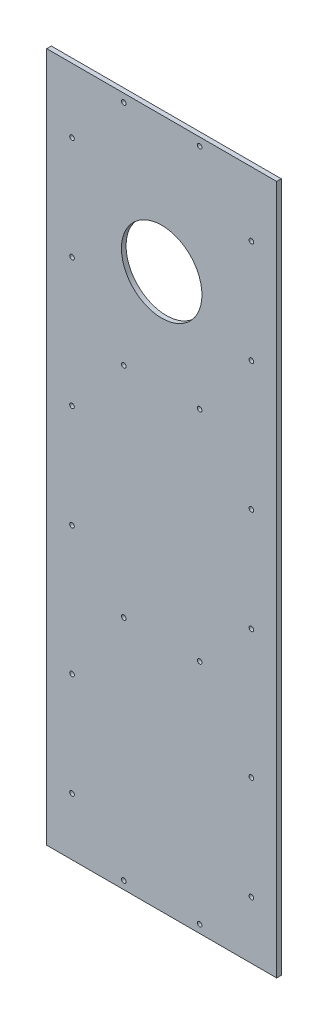
ISO-10303-21;
HEADER;
FILE_DESCRIPTION(('STEP AP214'),'2;1');
FILE_NAME('part.step','',(''),(''),'','','');
FILE_SCHEMA(('AUTOMOTIVE_DESIGN { 1 0 10303 214 1 1 1 1 }'));
ENDSEC;
DATA;
#1=APPLICATION_CONTEXT('core data for automotive mechanical design processes');
#2=APPLICATION_PROTOCOL_DEFINITION('international standard','automotive_design',2000,#1);
#3=PRODUCT_CONTEXT('',#1,'mechanical');
#4=PRODUCT('Part','Part','',(#3));
#5=PRODUCT_RELATED_PRODUCT_CATEGORY('part','',(#4));
#6=PRODUCT_DEFINITION_FORMATION('','',#4);
#7=PRODUCT_DEFINITION_CONTEXT('part definition',#1,'design');
#8=PRODUCT_DEFINITION('design','',#6,#7);
#9=PRODUCT_DEFINITION_SHAPE('','',#8);
#10=(LENGTH_UNIT() NAMED_UNIT(*) SI_UNIT(.MILLI.,.METRE.));
#11=(NAMED_UNIT(*) PLANE_ANGLE_UNIT() SI_UNIT($,.RADIAN.));
#12=(NAMED_UNIT(*) SI_UNIT($,.STERADIAN.) SOLID_ANGLE_UNIT());
#13=UNCERTAINTY_MEASURE_WITH_UNIT(LENGTH_MEASURE(1.E-05),#10,'distance_accuracy_value','');
#14=(GEOMETRIC_REPRESENTATION_CONTEXT(3) GLOBAL_UNCERTAINTY_ASSIGNED_CONTEXT((#13)) GLOBAL_UNIT_ASSIGNED_CONTEXT((#10,
#11,#12)) REPRESENTATION_CONTEXT('',''));
#15=CARTESIAN_POINT('',(0.,0.,0.));
#16=DIRECTION('',(0.,0.,1.));
#17=DIRECTION('',(1.,0.,0.));
#18=AXIS2_PLACEMENT_3D('',#15,#16,#17);
#19=CARTESIAN_POINT('',(-50.,-150.,2.));
#20=DIRECTION('',(1.,0.,0.));
#21=DIRECTION('',(0.,0.,-1.));
#22=AXIS2_PLACEMENT_3D('',#19,#20,#21);
#23=PLANE('',#22);
#24=DIRECTION('',(0.,-1.,0.));
#25=VECTOR('',#24,1.);
#26=CARTESIAN_POINT('',(-50.,-150.,0.));
#27=LINE('',#26,#25);
#28=CARTESIAN_POINT('',(-50.,150.,0.));
#29=VERTEX_POINT('',#28);
#30=CARTESIAN_POINT('',(-50.,-150.,0.));
#31=VERTEX_POINT('',#30);
#32=EDGE_CURVE('E104',#29,#31,#27,.T.);
#33=ORIENTED_EDGE('',*,*,#32,.T.);
#34=DIRECTION('',(0.,0.,-1.));
#35=VECTOR('',#34,1.);
#36=CARTESIAN_POINT('',(-50.,-150.,2.));
#37=LINE('',#36,#35);
#38=CARTESIAN_POINT('',(-50.,-150.,2.));
#39=VERTEX_POINT('',#38);
#40=EDGE_CURVE('E11',#39,#31,#37,.T.);
#41=ORIENTED_EDGE('',*,*,#40,.F.);
#42=DIRECTION('',(0.,-1.,0.));
#43=VECTOR('',#42,1.);
#44=CARTESIAN_POINT('',(-50.,-150.,2.));
#45=LINE('',#44,#43);
#46=CARTESIAN_POINT('',(-50.,150.,2.));
#47=VERTEX_POINT('',#46);
#48=EDGE_CURVE('E91',#47,#39,#45,.T.);
#49=ORIENTED_EDGE('',*,*,#48,.F.);
#50=DIRECTION('',(0.,0.,-1.));
#51=VECTOR('',#50,1.);
#52=CARTESIAN_POINT('',(-50.,150.,2.));
#53=LINE('',#52,#51);
#54=EDGE_CURVE('E100',#47,#29,#53,.T.);
#55=ORIENTED_EDGE('',*,*,#54,.T.);
#56=EDGE_LOOP('',(#33,#41,#49,#55));
#57=FACE_BOUND('',#56,.T.);
#58=ADVANCED_FACE('F38',(#57),#23,.F.);
#59=CARTESIAN_POINT('',(50.,-150.,2.));
#60=DIRECTION('',(0.,1.,0.));
#61=DIRECTION('',(0.,0.,1.));
#62=AXIS2_PLACEMENT_3D('',#59,#60,#61);
#63=PLANE('',#62);
#64=DIRECTION('',(1.,0.,0.));
#65=VECTOR('',#64,1.);
#66=CARTESIAN_POINT('',(50.,-150.,0.));
#67=LINE('',#66,#65);
#68=CARTESIAN_POINT('',(50.,-150.,0.));
#69=VERTEX_POINT('',#68);
#70=EDGE_CURVE('E95',#31,#69,#67,.T.);
#71=ORIENTED_EDGE('',*,*,#70,.T.);
#72=DIRECTION('',(0.,0.,-1.));
#73=VECTOR('',#72,1.);
#74=CARTESIAN_POINT('',(50.,-150.,2.));
#75=LINE('',#74,#73);
#76=CARTESIAN_POINT('',(50.,-150.,2.));
#77=VERTEX_POINT('',#76);
#78=EDGE_CURVE('E47',#77,#69,#75,.T.);
#79=ORIENTED_EDGE('',*,*,#78,.F.);
#80=DIRECTION('',(1.,0.,0.));
#81=VECTOR('',#80,1.);
#82=CARTESIAN_POINT('',(50.,-150.,2.));
#83=LINE('',#82,#81);
#84=EDGE_CURVE('E86',#39,#77,#83,.T.);
#85=ORIENTED_EDGE('',*,*,#84,.F.);
#86=ORIENTED_EDGE('',*,*,#40,.T.);
#87=EDGE_LOOP('',(#71,#79,#85,#86));
#88=FACE_BOUND('',#87,.T.);
#89=ADVANCED_FACE('F94',(#88),#63,.F.);
#90=CARTESIAN_POINT('',(50.,-150.,2.));
#91=DIRECTION('',(-1.,0.,0.));
#92=DIRECTION('',(0.,0.,1.));
#93=AXIS2_PLACEMENT_3D('',#90,#91,#92);
#94=PLANE('',#93);
#95=DIRECTION('',(0.,1.,0.));
#96=VECTOR('',#95,1.);
#97=CARTESIAN_POINT('',(50.,-150.,0.));
#98=LINE('',#97,#96);
#99=CARTESIAN_POINT('',(50.,150.,0.));
#100=VERTEX_POINT('',#99);
#101=EDGE_CURVE('E73',#69,#100,#98,.T.);
#102=ORIENTED_EDGE('',*,*,#101,.T.);
#103=DIRECTION('',(0.,0.,-1.));
#104=VECTOR('',#103,1.);
#105=CARTESIAN_POINT('',(50.,150.,2.));
#106=LINE('',#105,#104);
#107=CARTESIAN_POINT('',(50.,150.,2.));
#108=VERTEX_POINT('',#107);
#109=EDGE_CURVE('E96',#108,#100,#106,.T.);
#110=ORIENTED_EDGE('',*,*,#109,.F.);
#111=DIRECTION('',(0.,1.,0.));
#112=VECTOR('',#111,1.);
#113=CARTESIAN_POINT('',(50.,-150.,2.));
#114=LINE('',#113,#112);
#115=EDGE_CURVE('E89',#77,#108,#114,.T.);
#116=ORIENTED_EDGE('',*,*,#115,.F.);
#117=ORIENTED_EDGE('',*,*,#78,.T.);
#118=EDGE_LOOP('',(#102,#110,#116,#117));
#119=FACE_BOUND('',#118,.T.);
#120=ADVANCED_FACE('F98',(#119),#94,.F.);
#121=CARTESIAN_POINT('',(50.,150.,2.));
#122=DIRECTION('',(0.,-1.,0.));
#123=DIRECTION('',(1.,0.,0.));
#124=AXIS2_PLACEMENT_3D('',#121,#122,#123);
#125=PLANE('',#124);
#126=DIRECTION('',(-1.,0.,0.));
#127=VECTOR('',#126,1.);
#128=CARTESIAN_POINT('',(50.,150.,0.));
#129=LINE('',#128,#127);
#130=EDGE_CURVE('E79',#100,#29,#129,.T.);
#131=ORIENTED_EDGE('',*,*,#130,.T.);
#132=ORIENTED_EDGE('',*,*,#54,.F.);
#133=DIRECTION('',(-1.,0.,0.));
#134=VECTOR('',#133,1.);
#135=CARTESIAN_POINT('',(50.,150.,2.));
#136=LINE('',#135,#134);
#137=EDGE_CURVE('E56',#108,#47,#136,.T.);
#138=ORIENTED_EDGE('',*,*,#137,.F.);
#139=ORIENTED_EDGE('',*,*,#109,.T.);
#140=EDGE_LOOP('',(#131,#132,#138,#139));
#141=FACE_BOUND('',#140,.T.);
#142=ADVANCED_FACE('F238',(#141),#125,.F.);
#143=CARTESIAN_POINT('',(0.,0.,2.));
#144=DIRECTION('',(0.,0.,1.));
#145=DIRECTION('',(1.,0.,0.));
#146=AXIS2_PLACEMENT_3D('',#143,#144,#145);
#147=PLANE('',#146);
#148=CARTESIAN_POINT('',(16.4999999999995,47.5,2.));
#149=DIRECTION('',(0.,0.,1.));
#150=DIRECTION('',(1.,0.,0.));
#151=AXIS2_PLACEMENT_3D('',#148,#149,#150);
#152=CIRCLE('',#151,0.99999999999999);
#153=CARTESIAN_POINT('',(17.4999999999995,47.5,2.));
#154=VERTEX_POINT('',#153);
#155=EDGE_CURVE('E490',#154,#154,#152,.T.);
#156=ORIENTED_EDGE('',*,*,#155,.F.);
#157=EDGE_LOOP('',(#156));
#158=FACE_BOUND('',#157,.T.);
#159=CARTESIAN_POINT('',(-16.5000000000005,-47.5,2.));
#160=DIRECTION('',(0.,0.,1.));
#161=DIRECTION('',(1.,0.,0.));
#162=AXIS2_PLACEMENT_3D('',#159,#160,#161);
#163=CIRCLE('',#162,1.);
#164=CARTESIAN_POINT('',(-15.5000000000005,-47.5,2.));
#165=VERTEX_POINT('',#164);
#166=EDGE_CURVE('E491',#165,#165,#163,.T.);
#167=ORIENTED_EDGE('',*,*,#166,.F.);
#168=EDGE_LOOP('',(#167));
#169=FACE_BOUND('',#168,.T.);
#170=CARTESIAN_POINT('',(16.4999999999995,-47.5,2.));
#171=DIRECTION('',(0.,0.,1.));
#172=DIRECTION('',(1.,0.,0.));
#173=AXIS2_PLACEMENT_3D('',#170,#171,#172);
#174=CIRCLE('',#173,0.99999999999999);
#175=CARTESIAN_POINT('',(17.4999999999995,-47.5,2.));
#176=VERTEX_POINT('',#175);
#177=EDGE_CURVE('E495',#176,#176,#174,.T.);
#178=ORIENTED_EDGE('',*,*,#177,.F.);
#179=EDGE_LOOP('',(#178));
#180=FACE_BOUND('',#179,.T.);
#181=CARTESIAN_POINT('',(-16.5000000000005,47.5,2.));
#182=DIRECTION('',(0.,0.,1.));
#183=DIRECTION('',(1.,0.,0.));
#184=AXIS2_PLACEMENT_3D('',#181,#182,#183);
#185=CIRCLE('',#184,1.);
#186=CARTESIAN_POINT('',(-15.5000000000005,47.5,2.));
#187=VERTEX_POINT('',#186);
#188=EDGE_CURVE('E165',#187,#187,#185,.T.);
#189=ORIENTED_EDGE('',*,*,#188,.F.);
#190=EDGE_LOOP('',(#189));
#191=FACE_BOUND('',#190,.T.);
#192=CARTESIAN_POINT('',(0.,91.,2.));
#193=DIRECTION('',(0.,0.,1.));
#194=DIRECTION('',(1.,0.,0.));
#195=AXIS2_PLACEMENT_3D('',#192,#193,#194);
#196=CIRCLE('',#195,17.5);
#197=CARTESIAN_POINT('',(17.5,91.,2.));
#198=VERTEX_POINT('',#197);
#199=EDGE_CURVE('E176',#198,#198,#196,.T.);
#200=ORIENTED_EDGE('',*,*,#199,.F.);
#201=EDGE_LOOP('',(#200));
#202=FACE_BOUND('',#201,.T.);
#203=CARTESIAN_POINT('',(-39.,-23.9999999999995,2.));
#204=DIRECTION('',(0.,0.,1.));
#205=DIRECTION('',(1.,0.,0.));
#206=AXIS2_PLACEMENT_3D('',#203,#204,#205);
#207=CIRCLE('',#206,0.999999999999998);
#208=CARTESIAN_POINT('',(-38.,-23.9999999999995,2.));
#209=VERTEX_POINT('',#208);
#210=EDGE_CURVE('E213',#209,#209,#207,.T.);
#211=ORIENTED_EDGE('',*,*,#210,.F.);
#212=EDGE_LOOP('',(#211));
#213=FACE_BOUND('',#212,.T.);
#214=CARTESIAN_POINT('',(39.,21.,2.));
#215=DIRECTION('',(0.,0.,1.));
#216=DIRECTION('',(1.,0.,0.));
#217=AXIS2_PLACEMENT_3D('',#214,#215,#216);
#218=CIRCLE('',#217,0.999999999999998);
#219=CARTESIAN_POINT('',(40.,21.,2.));
#220=VERTEX_POINT('',#219);
#221=EDGE_CURVE('E210',#220,#220,#218,.T.);
#222=ORIENTED_EDGE('',*,*,#221,.F.);
#223=EDGE_LOOP('',(#222));
#224=FACE_BOUND('',#223,.T.);
#225=CARTESIAN_POINT('',(39.,-23.9999999999995,2.));
#226=DIRECTION('',(0.,0.,1.));
#227=DIRECTION('',(1.,0.,0.));
#228=AXIS2_PLACEMENT_3D('',#225,#226,#227);
#229=CIRCLE('',#228,0.999999999999998);
#230=CARTESIAN_POINT('',(40.,-23.9999999999995,2.));
#231=VERTEX_POINT('',#230);
#232=EDGE_CURVE('E207',#231,#231,#229,.T.);
#233=ORIENTED_EDGE('',*,*,#232,.F.);
#234=EDGE_LOOP('',(#233));
#235=FACE_BOUND('',#234,.T.);
#236=CARTESIAN_POINT('',(-39.,-80.,2.));
#237=DIRECTION('',(0.,0.,1.));
#238=DIRECTION('',(1.,0.,0.));
#239=AXIS2_PLACEMENT_3D('',#236,#237,#238);
#240=CIRCLE('',#239,0.999999999999998);
#241=CARTESIAN_POINT('',(-38.,-80.,2.));
#242=VERTEX_POINT('',#241);
#243=EDGE_CURVE('E204',#242,#242,#240,.T.);
#244=ORIENTED_EDGE('',*,*,#243,.F.);
#245=EDGE_LOOP('',(#244));
#246=FACE_BOUND('',#245,.T.);
#247=CARTESIAN_POINT('',(-39.,77.0000000000005,2.));
#248=DIRECTION('',(0.,0.,1.));
#249=DIRECTION('',(1.,0.,0.));
#250=AXIS2_PLACEMENT_3D('',#247,#248,#249);
#251=CIRCLE('',#250,0.999999999999998);
#252=CARTESIAN_POINT('',(-38.,77.0000000000005,2.));
#253=VERTEX_POINT('',#252);
#254=EDGE_CURVE('E225',#253,#253,#251,.T.);
#255=ORIENTED_EDGE('',*,*,#254,.F.);
#256=EDGE_LOOP('',(#255));
#257=FACE_BOUND('',#256,.T.);
#258=CARTESIAN_POINT('',(39.,122.,2.));
#259=DIRECTION('',(0.,0.,1.));
#260=DIRECTION('',(1.,0.,0.));
#261=AXIS2_PLACEMENT_3D('',#258,#259,#260);
#262=CIRCLE('',#261,0.999999999999998);
#263=CARTESIAN_POINT('',(40.,122.,2.));
#264=VERTEX_POINT('',#263);
#265=EDGE_CURVE('E222',#264,#264,#262,.T.);
#266=ORIENTED_EDGE('',*,*,#265,.F.);
#267=EDGE_LOOP('',(#266));
#268=FACE_BOUND('',#267,.T.);
#269=CARTESIAN_POINT('',(39.,77.0000000000005,2.));
#270=DIRECTION('',(0.,0.,1.));
#271=DIRECTION('',(1.,0.,0.));
#272=AXIS2_PLACEMENT_3D('',#269,#270,#271);
#273=CIRCLE('',#272,0.999999999999998);
#274=CARTESIAN_POINT('',(40.,77.0000000000005,2.));
#275=VERTEX_POINT('',#274);
#276=EDGE_CURVE('E219',#275,#275,#273,.T.);
#277=ORIENTED_EDGE('',*,*,#276,.F.);
#278=EDGE_LOOP('',(#277));
#279=FACE_BOUND('',#278,.T.);
#280=CARTESIAN_POINT('',(-39.,21.,2.));
#281=DIRECTION('',(0.,0.,1.));
#282=DIRECTION('',(1.,0.,0.));
#283=AXIS2_PLACEMENT_3D('',#280,#281,#282);
#284=CIRCLE('',#283,0.999999999999998);
#285=CARTESIAN_POINT('',(-38.,21.,2.));
#286=VERTEX_POINT('',#285);
#287=EDGE_CURVE('E216',#286,#286,#284,.T.);
#288=ORIENTED_EDGE('',*,*,#287,.F.);
#289=EDGE_LOOP('',(#288));
#290=FACE_BOUND('',#289,.T.);
#291=CARTESIAN_POINT('',(16.4999999999995,146.5,2.));
#292=DIRECTION('',(0.,0.,1.));
#293=DIRECTION('',(1.,0.,0.));
#294=AXIS2_PLACEMENT_3D('',#291,#292,#293);
#295=CIRCLE('',#294,1.);
#296=CARTESIAN_POINT('',(17.4999999999995,146.5,2.));
#297=VERTEX_POINT('',#296);
#298=EDGE_CURVE('E189',#297,#297,#295,.T.);
#299=ORIENTED_EDGE('',*,*,#298,.F.);
#300=EDGE_LOOP('',(#299));
#301=FACE_BOUND('',#300,.T.);
#302=CARTESIAN_POINT('',(-16.4999999999995,-146.5,2.));
#303=DIRECTION('',(0.,0.,1.));
#304=DIRECTION('',(-1.,0.,0.));
#305=AXIS2_PLACEMENT_3D('',#302,#303,#304);
#306=CIRCLE('',#305,1.);
#307=CARTESIAN_POINT('',(-17.4999999999995,-146.5,2.));
#308=VERTEX_POINT('',#307);
#309=EDGE_CURVE('E188',#308,#308,#306,.T.);
#310=ORIENTED_EDGE('',*,*,#309,.F.);
#311=EDGE_LOOP('',(#310));
#312=FACE_BOUND('',#311,.T.);
#313=CARTESIAN_POINT('',(-16.5000000000005,146.5,2.));
#314=DIRECTION('',(0.,0.,1.));
#315=DIRECTION('',(-1.,0.,0.));
#316=AXIS2_PLACEMENT_3D('',#313,#314,#315);
#317=CIRCLE('',#316,1.);
#318=CARTESIAN_POINT('',(-17.5000000000005,146.5,2.));
#319=VERTEX_POINT('',#318);
#320=EDGE_CURVE('E181',#319,#319,#317,.T.);
#321=ORIENTED_EDGE('',*,*,#320,.F.);
#322=EDGE_LOOP('',(#321));
#323=FACE_BOUND('',#322,.T.);
#324=CARTESIAN_POINT('',(-39.,-125.,2.));
#325=DIRECTION('',(0.,0.,1.));
#326=DIRECTION('',(1.,0.,0.));
#327=AXIS2_PLACEMENT_3D('',#324,#325,#326);
#328=CIRCLE('',#327,0.999999999999998);
#329=CARTESIAN_POINT('',(-38.,-125.,2.));
#330=VERTEX_POINT('',#329);
#331=EDGE_CURVE('E201',#330,#330,#328,.T.);
#332=ORIENTED_EDGE('',*,*,#331,.F.);
#333=EDGE_LOOP('',(#332));
#334=FACE_BOUND('',#333,.T.);
#335=CARTESIAN_POINT('',(39.,-80.,2.));
#336=DIRECTION('',(0.,0.,1.));
#337=DIRECTION('',(1.,0.,0.));
#338=AXIS2_PLACEMENT_3D('',#335,#336,#337);
#339=CIRCLE('',#338,0.999999999999998);
#340=CARTESIAN_POINT('',(40.,-80.,2.));
#341=VERTEX_POINT('',#340);
#342=EDGE_CURVE('E198',#341,#341,#339,.T.);
#343=ORIENTED_EDGE('',*,*,#342,.F.);
#344=EDGE_LOOP('',(#343));
#345=FACE_BOUND('',#344,.T.);
#346=CARTESIAN_POINT('',(39.,-125.,2.));
#347=DIRECTION('',(0.,0.,1.));
#348=DIRECTION('',(1.,0.,0.));
#349=AXIS2_PLACEMENT_3D('',#346,#347,#348);
#350=CIRCLE('',#349,0.999999999999998);
#351=CARTESIAN_POINT('',(40.,-125.,2.));
#352=VERTEX_POINT('',#351);
#353=EDGE_CURVE('E195',#352,#352,#350,.T.);
#354=ORIENTED_EDGE('',*,*,#353,.F.);
#355=EDGE_LOOP('',(#354));
#356=FACE_BOUND('',#355,.T.);
#357=CARTESIAN_POINT('',(16.5000000000005,-146.5,2.));
#358=DIRECTION('',(0.,0.,1.));
#359=DIRECTION('',(1.,0.,0.));
#360=AXIS2_PLACEMENT_3D('',#357,#358,#359);
#361=CIRCLE('',#360,1.);
#362=CARTESIAN_POINT('',(17.5000000000005,-146.5,2.));
#363=VERTEX_POINT('',#362);
#364=EDGE_CURVE('E192',#363,#363,#361,.T.);
#365=ORIENTED_EDGE('',*,*,#364,.F.);
#366=EDGE_LOOP('',(#365));
#367=FACE_BOUND('',#366,.T.);
#368=CARTESIAN_POINT('',(-39.,122.,2.));
#369=DIRECTION('',(0.,0.,1.));
#370=DIRECTION('',(1.,0.,0.));
#371=AXIS2_PLACEMENT_3D('',#368,#369,#370);
#372=CIRCLE('',#371,0.999999999999998);
#373=CARTESIAN_POINT('',(-38.,122.,2.));
#374=VERTEX_POINT('',#373);
#375=EDGE_CURVE('E117',#374,#374,#372,.T.);
#376=ORIENTED_EDGE('',*,*,#375,.F.);
#377=EDGE_LOOP('',(#376));
#378=FACE_BOUND('',#377,.T.);
#379=ORIENTED_EDGE('',*,*,#48,.T.);
#380=ORIENTED_EDGE('',*,*,#84,.T.);
#381=ORIENTED_EDGE('',*,*,#115,.T.);
#382=ORIENTED_EDGE('',*,*,#137,.T.);
#383=EDGE_LOOP('',(#379,#380,#381,#382));
#384=FACE_BOUND('',#383,.T.);
#385=ADVANCED_FACE('F87',(#158,#169,#180,#191,#202,#213,#224,#235,#246,#257,#268,#279,#290,#301,
#312,#323,#334,#345,#356,#367,#378,#384),#147,.T.);
#386=CARTESIAN_POINT('',(0.,0.,0.));
#387=DIRECTION('',(0.,0.,1.));
#388=DIRECTION('',(1.,0.,0.));
#389=AXIS2_PLACEMENT_3D('',#386,#387,#388);
#390=PLANE('',#389);
#391=CARTESIAN_POINT('',(16.4999999999995,47.5,0.));
#392=DIRECTION('',(0.,0.,1.));
#393=DIRECTION('',(1.,0.,0.));
#394=AXIS2_PLACEMENT_3D('',#391,#392,#393);
#395=CIRCLE('',#394,0.99999999999999);
#396=CARTESIAN_POINT('',(17.4999999999995,47.5,0.));
#397=VERTEX_POINT('',#396);
#398=EDGE_CURVE('E41',#397,#397,#395,.T.);
#399=ORIENTED_EDGE('',*,*,#398,.T.);
#400=EDGE_LOOP('',(#399));
#401=FACE_BOUND('',#400,.T.);
#402=CARTESIAN_POINT('',(-16.5000000000005,-47.5,0.));
#403=DIRECTION('',(0.,0.,1.));
#404=DIRECTION('',(1.,0.,0.));
#405=AXIS2_PLACEMENT_3D('',#402,#403,#404);
#406=CIRCLE('',#405,1.);
#407=CARTESIAN_POINT('',(-15.5000000000005,-47.5,0.));
#408=VERTEX_POINT('',#407);
#409=EDGE_CURVE('E167',#408,#408,#406,.T.);
#410=ORIENTED_EDGE('',*,*,#409,.T.);
#411=EDGE_LOOP('',(#410));
#412=FACE_BOUND('',#411,.T.);
#413=CARTESIAN_POINT('',(16.4999999999995,-47.5,0.));
#414=DIRECTION('',(0.,0.,1.));
#415=DIRECTION('',(1.,0.,0.));
#416=AXIS2_PLACEMENT_3D('',#413,#414,#415);
#417=CIRCLE('',#416,0.99999999999999);
#418=CARTESIAN_POINT('',(17.4999999999995,-47.5,0.));
#419=VERTEX_POINT('',#418);
#420=EDGE_CURVE('E164',#419,#419,#417,.T.);
#421=ORIENTED_EDGE('',*,*,#420,.T.);
#422=EDGE_LOOP('',(#421));
#423=FACE_BOUND('',#422,.T.);
#424=CARTESIAN_POINT('',(-16.5000000000005,47.5,0.));
#425=DIRECTION('',(0.,0.,1.));
#426=DIRECTION('',(1.,0.,0.));
#427=AXIS2_PLACEMENT_3D('',#424,#425,#426);
#428=CIRCLE('',#427,1.);
#429=CARTESIAN_POINT('',(-15.5000000000005,47.5,0.));
#430=VERTEX_POINT('',#429);
#431=EDGE_CURVE('E161',#430,#430,#428,.T.);
#432=ORIENTED_EDGE('',*,*,#431,.T.);
#433=EDGE_LOOP('',(#432));
#434=FACE_BOUND('',#433,.T.);
#435=CARTESIAN_POINT('',(0.,91.,0.));
#436=DIRECTION('',(0.,0.,-1.));
#437=DIRECTION('',(-1.,0.,0.));
#438=AXIS2_PLACEMENT_3D('',#435,#436,#437);
#439=CIRCLE('',#438,17.5);
#440=CARTESIAN_POINT('',(-17.5,91.,0.));
#441=VERTEX_POINT('',#440);
#442=EDGE_CURVE('E172',#441,#441,#439,.T.);
#443=ORIENTED_EDGE('',*,*,#442,.F.);
#444=EDGE_LOOP('',(#443));
#445=FACE_BOUND('',#444,.T.);
#446=CARTESIAN_POINT('',(-39.,-23.9999999999995,0.));
#447=DIRECTION('',(0.,0.,1.));
#448=DIRECTION('',(1.,0.,0.));
#449=AXIS2_PLACEMENT_3D('',#446,#447,#448);
#450=CIRCLE('',#449,0.999999999999998);
#451=CARTESIAN_POINT('',(-38.,-23.9999999999995,0.));
#452=VERTEX_POINT('',#451);
#453=EDGE_CURVE('E107',#452,#452,#450,.T.);
#454=ORIENTED_EDGE('',*,*,#453,.T.);
#455=EDGE_LOOP('',(#454));
#456=FACE_BOUND('',#455,.T.);
#457=CARTESIAN_POINT('',(39.,21.,0.));
#458=DIRECTION('',(0.,0.,1.));
#459=DIRECTION('',(1.,0.,0.));
#460=AXIS2_PLACEMENT_3D('',#457,#458,#459);
#461=CIRCLE('',#460,0.999999999999998);
#462=CARTESIAN_POINT('',(40.,21.,0.));
#463=VERTEX_POINT('',#462);
#464=EDGE_CURVE('E156',#463,#463,#461,.T.);
#465=ORIENTED_EDGE('',*,*,#464,.T.);
#466=EDGE_LOOP('',(#465));
#467=FACE_BOUND('',#466,.T.);
#468=CARTESIAN_POINT('',(39.,-23.9999999999995,0.));
#469=DIRECTION('',(0.,0.,1.));
#470=DIRECTION('',(1.,0.,0.));
#471=AXIS2_PLACEMENT_3D('',#468,#469,#470);
#472=CIRCLE('',#471,0.999999999999998);
#473=CARTESIAN_POINT('',(40.,-23.9999999999995,0.));
#474=VERTEX_POINT('',#473);
#475=EDGE_CURVE('E153',#474,#474,#472,.T.);
#476=ORIENTED_EDGE('',*,*,#475,.T.);
#477=EDGE_LOOP('',(#476));
#478=FACE_BOUND('',#477,.T.);
#479=CARTESIAN_POINT('',(-39.,-80.,0.));
#480=DIRECTION('',(0.,0.,1.));
#481=DIRECTION('',(1.,0.,0.));
#482=AXIS2_PLACEMENT_3D('',#479,#480,#481);
#483=CIRCLE('',#482,0.999999999999998);
#484=CARTESIAN_POINT('',(-38.,-80.,0.));
#485=VERTEX_POINT('',#484);
#486=EDGE_CURVE('E150',#485,#485,#483,.T.);
#487=ORIENTED_EDGE('',*,*,#486,.T.);
#488=EDGE_LOOP('',(#487));
#489=FACE_BOUND('',#488,.T.);
#490=CARTESIAN_POINT('',(-39.,77.0000000000005,0.));
#491=DIRECTION('',(0.,0.,1.));
#492=DIRECTION('',(1.,0.,0.));
#493=AXIS2_PLACEMENT_3D('',#490,#491,#492);
#494=CIRCLE('',#493,0.999999999999998);
#495=CARTESIAN_POINT('',(-38.,77.0000000000005,0.));
#496=VERTEX_POINT('',#495);
#497=EDGE_CURVE('E147',#496,#496,#494,.T.);
#498=ORIENTED_EDGE('',*,*,#497,.T.);
#499=EDGE_LOOP('',(#498));
#500=FACE_BOUND('',#499,.T.);
#501=CARTESIAN_POINT('',(39.,122.,0.));
#502=DIRECTION('',(0.,0.,1.));
#503=DIRECTION('',(1.,0.,0.));
#504=AXIS2_PLACEMENT_3D('',#501,#502,#503);
#505=CIRCLE('',#504,0.999999999999998);
#506=CARTESIAN_POINT('',(40.,122.,0.));
#507=VERTEX_POINT('',#506);
#508=EDGE_CURVE('E144',#507,#507,#505,.T.);
#509=ORIENTED_EDGE('',*,*,#508,.T.);
#510=EDGE_LOOP('',(#509));
#511=FACE_BOUND('',#510,.T.);
#512=CARTESIAN_POINT('',(39.,77.0000000000005,0.));
#513=DIRECTION('',(0.,0.,1.));
#514=DIRECTION('',(1.,0.,0.));
#515=AXIS2_PLACEMENT_3D('',#512,#513,#514);
#516=CIRCLE('',#515,0.999999999999998);
#517=CARTESIAN_POINT('',(40.,77.0000000000005,0.));
#518=VERTEX_POINT('',#517);
#519=EDGE_CURVE('E141',#518,#518,#516,.T.);
#520=ORIENTED_EDGE('',*,*,#519,.T.);
#521=EDGE_LOOP('',(#520));
#522=FACE_BOUND('',#521,.T.);
#523=CARTESIAN_POINT('',(-39.,21.,0.));
#524=DIRECTION('',(0.,0.,1.));
#525=DIRECTION('',(1.,0.,0.));
#526=AXIS2_PLACEMENT_3D('',#523,#524,#525);
#527=CIRCLE('',#526,0.999999999999998);
#528=CARTESIAN_POINT('',(-38.,21.,0.));
#529=VERTEX_POINT('',#528);
#530=EDGE_CURVE('E138',#529,#529,#527,.T.);
#531=ORIENTED_EDGE('',*,*,#530,.T.);
#532=EDGE_LOOP('',(#531));
#533=FACE_BOUND('',#532,.T.);
#534=CARTESIAN_POINT('',(16.4999999999995,146.5,0.));
#535=DIRECTION('',(0.,0.,1.));
#536=DIRECTION('',(1.,0.,0.));
#537=AXIS2_PLACEMENT_3D('',#534,#535,#536);
#538=CIRCLE('',#537,1.);
#539=CARTESIAN_POINT('',(17.4999999999995,146.5,0.));
#540=VERTEX_POINT('',#539);
#541=EDGE_CURVE('E135',#540,#540,#538,.T.);
#542=ORIENTED_EDGE('',*,*,#541,.T.);
#543=EDGE_LOOP('',(#542));
#544=FACE_BOUND('',#543,.T.);
#545=CARTESIAN_POINT('',(-16.4999999999995,-146.5,0.));
#546=DIRECTION('',(0.,0.,1.));
#547=DIRECTION('',(1.,0.,0.));
#548=AXIS2_PLACEMENT_3D('',#545,#546,#547);
#549=CIRCLE('',#548,1.);
#550=CARTESIAN_POINT('',(-15.4999999999995,-146.5,0.));
#551=VERTEX_POINT('',#550);
#552=EDGE_CURVE('E132',#551,#551,#549,.T.);
#553=ORIENTED_EDGE('',*,*,#552,.T.);
#554=EDGE_LOOP('',(#553));
#555=FACE_BOUND('',#554,.T.);
#556=CARTESIAN_POINT('',(-16.5000000000005,146.5,0.));
#557=DIRECTION('',(0.,0.,1.));
#558=DIRECTION('',(1.,0.,0.));
#559=AXIS2_PLACEMENT_3D('',#556,#557,#558);
#560=CIRCLE('',#559,1.);
#561=CARTESIAN_POINT('',(-15.5000000000005,146.5,0.));
#562=VERTEX_POINT('',#561);
#563=EDGE_CURVE('E129',#562,#562,#560,.T.);
#564=ORIENTED_EDGE('',*,*,#563,.T.);
#565=EDGE_LOOP('',(#564));
#566=FACE_BOUND('',#565,.T.);
#567=CARTESIAN_POINT('',(-39.,-125.,0.));
#568=DIRECTION('',(0.,0.,1.));
#569=DIRECTION('',(1.,0.,0.));
#570=AXIS2_PLACEMENT_3D('',#567,#568,#569);
#571=CIRCLE('',#570,0.999999999999998);
#572=CARTESIAN_POINT('',(-38.,-125.,0.));
#573=VERTEX_POINT('',#572);
#574=EDGE_CURVE('E126',#573,#573,#571,.T.);
#575=ORIENTED_EDGE('',*,*,#574,.T.);
#576=EDGE_LOOP('',(#575));
#577=FACE_BOUND('',#576,.T.);
#578=CARTESIAN_POINT('',(39.,-80.,0.));
#579=DIRECTION('',(0.,0.,1.));
#580=DIRECTION('',(1.,0.,0.));
#581=AXIS2_PLACEMENT_3D('',#578,#579,#580);
#582=CIRCLE('',#581,0.999999999999998);
#583=CARTESIAN_POINT('',(40.,-80.,0.));
#584=VERTEX_POINT('',#583);
#585=EDGE_CURVE('E123',#584,#584,#582,.T.);
#586=ORIENTED_EDGE('',*,*,#585,.T.);
#587=EDGE_LOOP('',(#586));
#588=FACE_BOUND('',#587,.T.);
#589=CARTESIAN_POINT('',(39.,-125.,0.));
#590=DIRECTION('',(0.,0.,1.));
#591=DIRECTION('',(1.,0.,0.));
#592=AXIS2_PLACEMENT_3D('',#589,#590,#591);
#593=CIRCLE('',#592,0.999999999999998);
#594=CARTESIAN_POINT('',(40.,-125.,0.));
#595=VERTEX_POINT('',#594);
#596=EDGE_CURVE('E120',#595,#595,#593,.T.);
#597=ORIENTED_EDGE('',*,*,#596,.T.);
#598=EDGE_LOOP('',(#597));
#599=FACE_BOUND('',#598,.T.);
#600=CARTESIAN_POINT('',(16.5000000000005,-146.5,0.));
#601=DIRECTION('',(0.,0.,1.));
#602=DIRECTION('',(1.,0.,0.));
#603=AXIS2_PLACEMENT_3D('',#600,#601,#602);
#604=CIRCLE('',#603,1.);
#605=CARTESIAN_POINT('',(17.5000000000005,-146.5,0.));
#606=VERTEX_POINT('',#605);
#607=EDGE_CURVE('E116',#606,#606,#604,.T.);
#608=ORIENTED_EDGE('',*,*,#607,.T.);
#609=EDGE_LOOP('',(#608));
#610=FACE_BOUND('',#609,.T.);
#611=CARTESIAN_POINT('',(-39.,122.,0.));
#612=DIRECTION('',(0.,0.,1.));
#613=DIRECTION('',(1.,0.,0.));
#614=AXIS2_PLACEMENT_3D('',#611,#612,#613);
#615=CIRCLE('',#614,0.999999999999998);
#616=CARTESIAN_POINT('',(-38.,122.,0.));
#617=VERTEX_POINT('',#616);
#618=EDGE_CURVE('E113',#617,#617,#615,.T.);
#619=ORIENTED_EDGE('',*,*,#618,.T.);
#620=EDGE_LOOP('',(#619));
#621=FACE_BOUND('',#620,.T.);
#622=ORIENTED_EDGE('',*,*,#32,.F.);
#623=ORIENTED_EDGE('',*,*,#130,.F.);
#624=ORIENTED_EDGE('',*,*,#101,.F.);
#625=ORIENTED_EDGE('',*,*,#70,.F.);
#626=EDGE_LOOP('',(#622,#623,#624,#625));
#627=FACE_BOUND('',#626,.T.);
#628=ADVANCED_FACE('F237',(#401,#412,#423,#434,#445,#456,#467,#478,#489,#500,#511,#522,#533,
#544,#555,#566,#577,#588,#599,#610,#621,#627),#390,.F.);
#629=CARTESIAN_POINT('',(-39.,122.,-8.));
#630=DIRECTION('',(0.,0.,1.));
#631=DIRECTION('',(1.,0.,0.));
#632=AXIS2_PLACEMENT_3D('',#629,#630,#631);
#633=CYLINDRICAL_SURFACE('',#632,0.999999999999998);
#634=ORIENTED_EDGE('',*,*,#375,.T.);
#635=EDGE_LOOP('',(#634));
#636=FACE_BOUND('',#635,.T.);
#637=ORIENTED_EDGE('',*,*,#618,.F.);
#638=EDGE_LOOP('',(#637));
#639=FACE_BOUND('',#638,.T.);
#640=ADVANCED_FACE('F233',(#636,#639),#633,.F.);
#641=CARTESIAN_POINT('',(16.5000000000005,-146.5,-8.));
#642=DIRECTION('',(0.,0.,1.));
#643=DIRECTION('',(1.,0.,0.));
#644=AXIS2_PLACEMENT_3D('',#641,#642,#643);
#645=CYLINDRICAL_SURFACE('',#644,1.);
#646=ORIENTED_EDGE('',*,*,#364,.T.);
#647=EDGE_LOOP('',(#646));
#648=FACE_BOUND('',#647,.T.);
#649=ORIENTED_EDGE('',*,*,#607,.F.);
#650=EDGE_LOOP('',(#649));
#651=FACE_BOUND('',#650,.T.);
#652=ADVANCED_FACE('F277',(#648,#651),#645,.F.);
#653=CARTESIAN_POINT('',(39.,-125.,-8.));
#654=DIRECTION('',(0.,0.,1.));
#655=DIRECTION('',(1.,0.,0.));
#656=AXIS2_PLACEMENT_3D('',#653,#654,#655);
#657=CYLINDRICAL_SURFACE('',#656,0.999999999999998);
#658=ORIENTED_EDGE('',*,*,#353,.T.);
#659=EDGE_LOOP('',(#658));
#660=FACE_BOUND('',#659,.T.);
#661=ORIENTED_EDGE('',*,*,#596,.F.);
#662=EDGE_LOOP('',(#661));
#663=FACE_BOUND('',#662,.T.);
#664=ADVANCED_FACE('F286',(#660,#663),#657,.F.);
#665=CARTESIAN_POINT('',(39.,-80.,-8.));
#666=DIRECTION('',(0.,0.,1.));
#667=DIRECTION('',(1.,0.,0.));
#668=AXIS2_PLACEMENT_3D('',#665,#666,#667);
#669=CYLINDRICAL_SURFACE('',#668,0.999999999999998);
#670=ORIENTED_EDGE('',*,*,#342,.T.);
#671=EDGE_LOOP('',(#670));
#672=FACE_BOUND('',#671,.T.);
#673=ORIENTED_EDGE('',*,*,#585,.F.);
#674=EDGE_LOOP('',(#673));
#675=FACE_BOUND('',#674,.T.);
#676=ADVANCED_FACE('F296',(#672,#675),#669,.F.);
#677=CARTESIAN_POINT('',(-39.,-125.,-8.));
#678=DIRECTION('',(0.,0.,1.));
#679=DIRECTION('',(1.,0.,0.));
#680=AXIS2_PLACEMENT_3D('',#677,#678,#679);
#681=CYLINDRICAL_SURFACE('',#680,0.999999999999998);
#682=ORIENTED_EDGE('',*,*,#331,.T.);
#683=EDGE_LOOP('',(#682));
#684=FACE_BOUND('',#683,.T.);
#685=ORIENTED_EDGE('',*,*,#574,.F.);
#686=EDGE_LOOP('',(#685));
#687=FACE_BOUND('',#686,.T.);
#688=ADVANCED_FACE('F306',(#684,#687),#681,.F.);
#689=CARTESIAN_POINT('',(-16.5000000000005,146.5,-8.));
#690=DIRECTION('',(0.,0.,1.));
#691=DIRECTION('',(1.,0.,0.));
#692=AXIS2_PLACEMENT_3D('',#689,#690,#691);
#693=CYLINDRICAL_SURFACE('',#692,1.);
#694=ORIENTED_EDGE('',*,*,#320,.T.);
#695=EDGE_LOOP('',(#694));
#696=FACE_BOUND('',#695,.T.);
#697=ORIENTED_EDGE('',*,*,#563,.F.);
#698=EDGE_LOOP('',(#697));
#699=FACE_BOUND('',#698,.T.);
#700=ADVANCED_FACE('F316',(#696,#699),#693,.F.);
#701=CARTESIAN_POINT('',(-16.4999999999995,-146.5,-8.));
#702=DIRECTION('',(0.,0.,1.));
#703=DIRECTION('',(1.,0.,0.));
#704=AXIS2_PLACEMENT_3D('',#701,#702,#703);
#705=CYLINDRICAL_SURFACE('',#704,1.);
#706=ORIENTED_EDGE('',*,*,#309,.T.);
#707=EDGE_LOOP('',(#706));
#708=FACE_BOUND('',#707,.T.);
#709=ORIENTED_EDGE('',*,*,#552,.F.);
#710=EDGE_LOOP('',(#709));
#711=FACE_BOUND('',#710,.T.);
#712=ADVANCED_FACE('F326',(#708,#711),#705,.F.);
#713=CARTESIAN_POINT('',(16.4999999999995,146.5,-8.));
#714=DIRECTION('',(0.,0.,1.));
#715=DIRECTION('',(1.,0.,0.));
#716=AXIS2_PLACEMENT_3D('',#713,#714,#715);
#717=CYLINDRICAL_SURFACE('',#716,1.);
#718=ORIENTED_EDGE('',*,*,#298,.T.);
#719=EDGE_LOOP('',(#718));
#720=FACE_BOUND('',#719,.T.);
#721=ORIENTED_EDGE('',*,*,#541,.F.);
#722=EDGE_LOOP('',(#721));
#723=FACE_BOUND('',#722,.T.);
#724=ADVANCED_FACE('F336',(#720,#723),#717,.F.);
#725=CARTESIAN_POINT('',(-39.,21.,-8.));
#726=DIRECTION('',(0.,0.,1.));
#727=DIRECTION('',(1.,0.,0.));
#728=AXIS2_PLACEMENT_3D('',#725,#726,#727);
#729=CYLINDRICAL_SURFACE('',#728,0.999999999999998);
#730=ORIENTED_EDGE('',*,*,#287,.T.);
#731=EDGE_LOOP('',(#730));
#732=FACE_BOUND('',#731,.T.);
#733=ORIENTED_EDGE('',*,*,#530,.F.);
#734=EDGE_LOOP('',(#733));
#735=FACE_BOUND('',#734,.T.);
#736=ADVANCED_FACE('F346',(#732,#735),#729,.F.);
#737=CARTESIAN_POINT('',(39.,77.0000000000005,-8.));
#738=DIRECTION('',(0.,0.,1.));
#739=DIRECTION('',(1.,0.,0.));
#740=AXIS2_PLACEMENT_3D('',#737,#738,#739);
#741=CYLINDRICAL_SURFACE('',#740,0.999999999999998);
#742=ORIENTED_EDGE('',*,*,#276,.T.);
#743=EDGE_LOOP('',(#742));
#744=FACE_BOUND('',#743,.T.);
#745=ORIENTED_EDGE('',*,*,#519,.F.);
#746=EDGE_LOOP('',(#745));
#747=FACE_BOUND('',#746,.T.);
#748=ADVANCED_FACE('F356',(#744,#747),#741,.F.);
#749=CARTESIAN_POINT('',(39.,122.,-8.));
#750=DIRECTION('',(0.,0.,1.));
#751=DIRECTION('',(1.,0.,0.));
#752=AXIS2_PLACEMENT_3D('',#749,#750,#751);
#753=CYLINDRICAL_SURFACE('',#752,0.999999999999998);
#754=ORIENTED_EDGE('',*,*,#265,.T.);
#755=EDGE_LOOP('',(#754));
#756=FACE_BOUND('',#755,.T.);
#757=ORIENTED_EDGE('',*,*,#508,.F.);
#758=EDGE_LOOP('',(#757));
#759=FACE_BOUND('',#758,.T.);
#760=ADVANCED_FACE('F366',(#756,#759),#753,.F.);
#761=CARTESIAN_POINT('',(-39.,77.0000000000005,-8.));
#762=DIRECTION('',(0.,0.,1.));
#763=DIRECTION('',(1.,0.,0.));
#764=AXIS2_PLACEMENT_3D('',#761,#762,#763);
#765=CYLINDRICAL_SURFACE('',#764,0.999999999999998);
#766=ORIENTED_EDGE('',*,*,#254,.T.);
#767=EDGE_LOOP('',(#766));
#768=FACE_BOUND('',#767,.T.);
#769=ORIENTED_EDGE('',*,*,#497,.F.);
#770=EDGE_LOOP('',(#769));
#771=FACE_BOUND('',#770,.T.);
#772=ADVANCED_FACE('F376',(#768,#771),#765,.F.);
#773=CARTESIAN_POINT('',(-39.,-80.,-8.));
#774=DIRECTION('',(0.,0.,1.));
#775=DIRECTION('',(1.,0.,0.));
#776=AXIS2_PLACEMENT_3D('',#773,#774,#775);
#777=CYLINDRICAL_SURFACE('',#776,0.999999999999998);
#778=ORIENTED_EDGE('',*,*,#243,.T.);
#779=EDGE_LOOP('',(#778));
#780=FACE_BOUND('',#779,.T.);
#781=ORIENTED_EDGE('',*,*,#486,.F.);
#782=EDGE_LOOP('',(#781));
#783=FACE_BOUND('',#782,.T.);
#784=ADVANCED_FACE('F386',(#780,#783),#777,.F.);
#785=CARTESIAN_POINT('',(39.,-23.9999999999995,-8.));
#786=DIRECTION('',(0.,0.,1.));
#787=DIRECTION('',(1.,0.,0.));
#788=AXIS2_PLACEMENT_3D('',#785,#786,#787);
#789=CYLINDRICAL_SURFACE('',#788,0.999999999999998);
#790=ORIENTED_EDGE('',*,*,#232,.T.);
#791=EDGE_LOOP('',(#790));
#792=FACE_BOUND('',#791,.T.);
#793=ORIENTED_EDGE('',*,*,#475,.F.);
#794=EDGE_LOOP('',(#793));
#795=FACE_BOUND('',#794,.T.);
#796=ADVANCED_FACE('F396',(#792,#795),#789,.F.);
#797=CARTESIAN_POINT('',(39.,21.,-8.));
#798=DIRECTION('',(0.,0.,1.));
#799=DIRECTION('',(1.,0.,0.));
#800=AXIS2_PLACEMENT_3D('',#797,#798,#799);
#801=CYLINDRICAL_SURFACE('',#800,0.999999999999998);
#802=ORIENTED_EDGE('',*,*,#221,.T.);
#803=EDGE_LOOP('',(#802));
#804=FACE_BOUND('',#803,.T.);
#805=ORIENTED_EDGE('',*,*,#464,.F.);
#806=EDGE_LOOP('',(#805));
#807=FACE_BOUND('',#806,.T.);
#808=ADVANCED_FACE('F406',(#804,#807),#801,.F.);
#809=CARTESIAN_POINT('',(-39.,-23.9999999999995,-8.));
#810=DIRECTION('',(0.,0.,1.));
#811=DIRECTION('',(1.,0.,0.));
#812=AXIS2_PLACEMENT_3D('',#809,#810,#811);
#813=CYLINDRICAL_SURFACE('',#812,0.999999999999998);
#814=ORIENTED_EDGE('',*,*,#210,.T.);
#815=EDGE_LOOP('',(#814));
#816=FACE_BOUND('',#815,.T.);
#817=ORIENTED_EDGE('',*,*,#453,.F.);
#818=EDGE_LOOP('',(#817));
#819=FACE_BOUND('',#818,.T.);
#820=ADVANCED_FACE('F416',(#816,#819),#813,.F.);
#821=CARTESIAN_POINT('',(0.,91.,10.));
#822=DIRECTION('',(0.,0.,-1.));
#823=DIRECTION('',(-1.,0.,0.));
#824=AXIS2_PLACEMENT_3D('',#821,#822,#823);
#825=CYLINDRICAL_SURFACE('',#824,17.5);
#826=ORIENTED_EDGE('',*,*,#199,.T.);
#827=EDGE_LOOP('',(#826));
#828=FACE_BOUND('',#827,.T.);
#829=ORIENTED_EDGE('',*,*,#442,.T.);
#830=EDGE_LOOP('',(#829));
#831=FACE_BOUND('',#830,.T.);
#832=ADVANCED_FACE('F426',(#828,#831),#825,.F.);
#833=CARTESIAN_POINT('',(-16.5000000000005,47.5,-8.));
#834=DIRECTION('',(0.,0.,1.));
#835=DIRECTION('',(1.,0.,0.));
#836=AXIS2_PLACEMENT_3D('',#833,#834,#835);
#837=CYLINDRICAL_SURFACE('',#836,1.);
#838=ORIENTED_EDGE('',*,*,#188,.T.);
#839=EDGE_LOOP('',(#838));
#840=FACE_BOUND('',#839,.T.);
#841=ORIENTED_EDGE('',*,*,#431,.F.);
#842=EDGE_LOOP('',(#841));
#843=FACE_BOUND('',#842,.T.);
#844=ADVANCED_FACE('F435',(#840,#843),#837,.F.);
#845=CARTESIAN_POINT('',(16.4999999999995,-47.5,-8.));
#846=DIRECTION('',(0.,0.,1.));
#847=DIRECTION('',(1.,0.,0.));
#848=AXIS2_PLACEMENT_3D('',#845,#846,#847);
#849=CYLINDRICAL_SURFACE('',#848,0.99999999999999);
#850=ORIENTED_EDGE('',*,*,#177,.T.);
#851=EDGE_LOOP('',(#850));
#852=FACE_BOUND('',#851,.T.);
#853=ORIENTED_EDGE('',*,*,#420,.F.);
#854=EDGE_LOOP('',(#853));
#855=FACE_BOUND('',#854,.T.);
#856=ADVANCED_FACE('F454',(#852,#855),#849,.F.);
#857=CARTESIAN_POINT('',(-16.5000000000005,-47.5,-8.));
#858=DIRECTION('',(0.,0.,1.));
#859=DIRECTION('',(1.,0.,0.));
#860=AXIS2_PLACEMENT_3D('',#857,#858,#859);
#861=CYLINDRICAL_SURFACE('',#860,1.);
#862=ORIENTED_EDGE('',*,*,#166,.T.);
#863=EDGE_LOOP('',(#862));
#864=FACE_BOUND('',#863,.T.);
#865=ORIENTED_EDGE('',*,*,#409,.F.);
#866=EDGE_LOOP('',(#865));
#867=FACE_BOUND('',#866,.T.);
#868=ADVANCED_FACE('F464',(#864,#867),#861,.F.);
#869=CARTESIAN_POINT('',(16.4999999999995,47.5,-8.));
#870=DIRECTION('',(0.,0.,1.));
#871=DIRECTION('',(1.,0.,0.));
#872=AXIS2_PLACEMENT_3D('',#869,#870,#871);
#873=CYLINDRICAL_SURFACE('',#872,0.99999999999999);
#874=ORIENTED_EDGE('',*,*,#155,.T.);
#875=EDGE_LOOP('',(#874));
#876=FACE_BOUND('',#875,.T.);
#877=ORIENTED_EDGE('',*,*,#398,.F.);
#878=EDGE_LOOP('',(#877));
#879=FACE_BOUND('',#878,.T.);
#880=ADVANCED_FACE('F474',(#876,#879),#873,.F.);
#881=CLOSED_SHELL('',(#58,#89,#120,#142,#385,#628,#640,#652,#664,#676,#688,#700,#712,#724,#736,
#748,#760,#772,#784,#796,#808,#820,#832,#844,#856,#868,#880));
#882=MANIFOLD_SOLID_BREP('B2',#881);
#883=ADVANCED_BREP_SHAPE_REPRESENTATION('',(#18,#882),#14);
#884=SHAPE_DEFINITION_REPRESENTATION(#9,#883);
ENDSEC;
END-ISO-10303-21;
